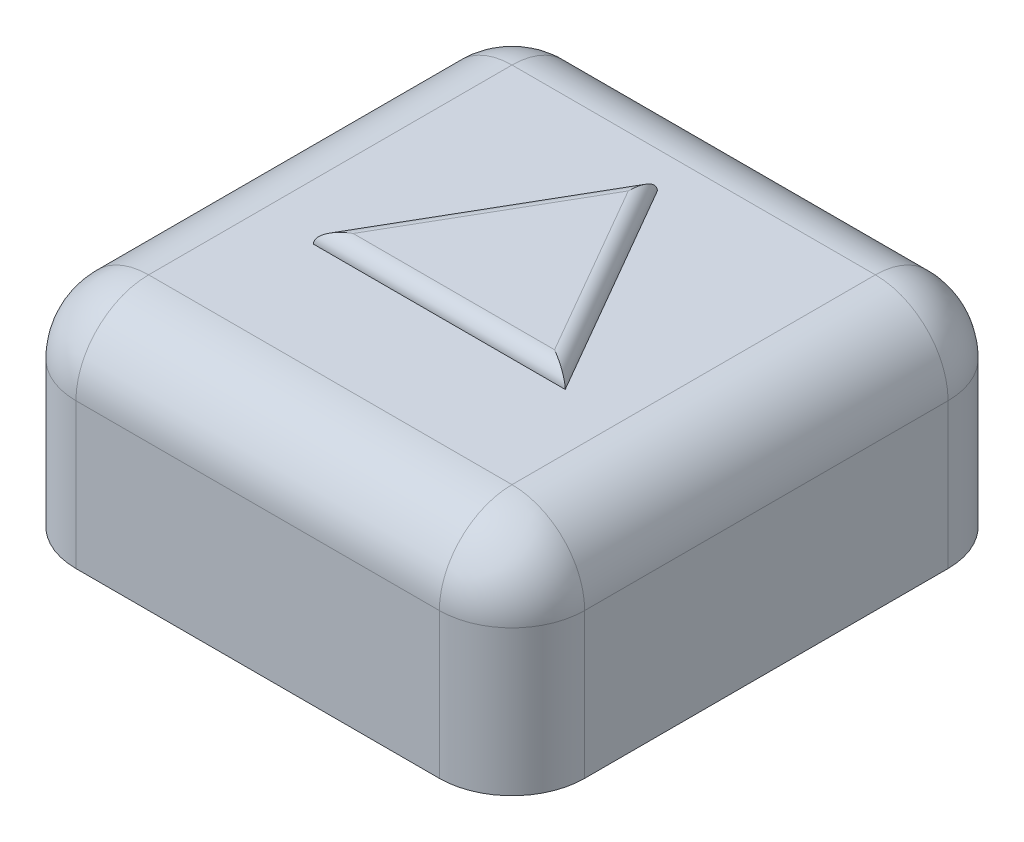
ISO-10303-21;
HEADER;
FILE_DESCRIPTION(('STEP AP214'),'2;1');
FILE_NAME('part.step','',(''),(''),'','','');
FILE_SCHEMA(('AUTOMOTIVE_DESIGN { 1 0 10303 214 1 1 1 1 }'));
ENDSEC;
DATA;
#1=APPLICATION_CONTEXT('core data for automotive mechanical design processes');
#2=APPLICATION_PROTOCOL_DEFINITION('international standard','automotive_design',2000,#1);
#3=PRODUCT_CONTEXT('',#1,'mechanical');
#4=PRODUCT('Part','Part','',(#3));
#5=PRODUCT_RELATED_PRODUCT_CATEGORY('part','',(#4));
#6=PRODUCT_DEFINITION_FORMATION('','',#4);
#7=PRODUCT_DEFINITION_CONTEXT('part definition',#1,'design');
#8=PRODUCT_DEFINITION('design','',#6,#7);
#9=PRODUCT_DEFINITION_SHAPE('','',#8);
#10=(LENGTH_UNIT() NAMED_UNIT(*) SI_UNIT(.MILLI.,.METRE.));
#11=(NAMED_UNIT(*) PLANE_ANGLE_UNIT() SI_UNIT($,.RADIAN.));
#12=(NAMED_UNIT(*) SI_UNIT($,.STERADIAN.) SOLID_ANGLE_UNIT());
#13=UNCERTAINTY_MEASURE_WITH_UNIT(LENGTH_MEASURE(1.E-05),#10,'distance_accuracy_value','');
#14=(GEOMETRIC_REPRESENTATION_CONTEXT(3) GLOBAL_UNCERTAINTY_ASSIGNED_CONTEXT((#13)) GLOBAL_UNIT_ASSIGNED_CONTEXT((#10,
#11,#12)) REPRESENTATION_CONTEXT('',''));
#15=CARTESIAN_POINT('',(0.,0.,0.));
#16=DIRECTION('',(0.,0.,1.));
#17=DIRECTION('',(1.,0.,0.));
#18=AXIS2_PLACEMENT_3D('',#15,#16,#17);
#19=CARTESIAN_POINT('',(0.,3.,0.));
#20=DIRECTION('',(0.,1.,0.));
#21=DIRECTION('',(0.,0.,1.));
#22=AXIS2_PLACEMENT_3D('',#19,#20,#21);
#23=PLANE('',#22);
#24=DIRECTION('',(0.,0.,-1.));
#25=VECTOR('',#24,1.);
#26=CARTESIAN_POINT('',(2.5,3.,-3.5));
#27=LINE('',#26,#25);
#28=CARTESIAN_POINT('',(2.5,3.,2.5));
#29=VERTEX_POINT('',#28);
#30=CARTESIAN_POINT('',(2.5,3.,-2.5));
#31=VERTEX_POINT('',#30);
#32=EDGE_CURVE('E194',#29,#31,#27,.T.);
#33=ORIENTED_EDGE('',*,*,#32,.T.);
#34=DIRECTION('',(-1.,0.,0.));
#35=VECTOR('',#34,1.);
#36=CARTESIAN_POINT('',(-3.5,3.,-2.5));
#37=LINE('',#36,#35);
#38=CARTESIAN_POINT('',(-2.5,3.,-2.5));
#39=VERTEX_POINT('',#38);
#40=EDGE_CURVE('E200',#31,#39,#37,.T.);
#41=ORIENTED_EDGE('',*,*,#40,.T.);
#42=DIRECTION('',(0.,0.,1.));
#43=VECTOR('',#42,1.);
#44=CARTESIAN_POINT('',(-2.5,3.,3.5));
#45=LINE('',#44,#43);
#46=CARTESIAN_POINT('',(-2.5,3.,2.5));
#47=VERTEX_POINT('',#46);
#48=EDGE_CURVE('E198',#39,#47,#45,.T.);
#49=ORIENTED_EDGE('',*,*,#48,.T.);
#50=DIRECTION('',(1.,0.,0.));
#51=VECTOR('',#50,1.);
#52=CARTESIAN_POINT('',(3.5,3.,2.5));
#53=LINE('',#52,#51);
#54=EDGE_CURVE('E196',#47,#29,#53,.T.);
#55=ORIENTED_EDGE('',*,*,#54,.T.);
#56=EDGE_LOOP('',(#33,#41,#49,#55));
#57=FACE_BOUND('',#56,.T.);
#58=DIRECTION('',(-0.500000000000002,0.,0.866025403784437));
#59=VECTOR('',#58,1.);
#60=CARTESIAN_POINT('',(0.,3.,-1.99999999999999));
#61=LINE('',#60,#59);
#62=CARTESIAN_POINT('',(0.,3.,-1.99999999999999));
#63=VERTEX_POINT('',#62);
#64=CARTESIAN_POINT('',(-1.73205080756888,3.,1.));
#65=VERTEX_POINT('',#64);
#66=EDGE_CURVE('E133',#63,#65,#61,.T.);
#67=ORIENTED_EDGE('',*,*,#66,.F.);
#68=DIRECTION('',(-0.500000000000002,0.,-0.866025403784437));
#69=VECTOR('',#68,1.);
#70=CARTESIAN_POINT('',(1.73205080756888,3.,1.));
#71=LINE('',#70,#69);
#72=CARTESIAN_POINT('',(1.73205080756888,3.,1.));
#73=VERTEX_POINT('',#72);
#74=EDGE_CURVE('E138',#73,#63,#71,.T.);
#75=ORIENTED_EDGE('',*,*,#74,.F.);
#76=DIRECTION('',(1.,0.,0.));
#77=VECTOR('',#76,1.);
#78=CARTESIAN_POINT('',(-1.73205080756888,3.,1.));
#79=LINE('',#78,#77);
#80=EDGE_CURVE('E143',#65,#73,#79,.T.);
#81=ORIENTED_EDGE('',*,*,#80,.F.);
#82=EDGE_LOOP('',(#67,#75,#81));
#83=FACE_BOUND('',#82,.T.);
#84=ADVANCED_FACE('F35',(#57,#83),#23,.T.);
#85=CARTESIAN_POINT('',(3.5,3.,-3.5));
#86=DIRECTION('',(-1.,0.,0.));
#87=DIRECTION('',(0.,0.,1.));
#88=AXIS2_PLACEMENT_3D('',#85,#86,#87);
#89=PLANE('',#88);
#90=DIRECTION('',(0.,0.,-1.));
#91=VECTOR('',#90,1.);
#92=CARTESIAN_POINT('',(3.5,0.,-3.5));
#93=LINE('',#92,#91);
#94=CARTESIAN_POINT('',(3.5,0.,2.5));
#95=VERTEX_POINT('',#94);
#96=CARTESIAN_POINT('',(3.5,0.,-2.5));
#97=VERTEX_POINT('',#96);
#98=EDGE_CURVE('E148',#95,#97,#93,.T.);
#99=ORIENTED_EDGE('',*,*,#98,.T.);
#100=DIRECTION('',(0.,-1.,0.));
#101=VECTOR('',#100,1.);
#102=CARTESIAN_POINT('',(3.5,3.,-2.5));
#103=LINE('',#102,#101);
#104=CARTESIAN_POINT('',(3.5,2.,-2.5));
#105=VERTEX_POINT('',#104);
#106=EDGE_CURVE('E180',#97,#105,#103,.F.);
#107=ORIENTED_EDGE('',*,*,#106,.T.);
#108=DIRECTION('',(0.,0.,-1.));
#109=VECTOR('',#108,1.);
#110=CARTESIAN_POINT('',(3.5,2.,3.5));
#111=LINE('',#110,#109);
#112=CARTESIAN_POINT('',(3.5,2.,2.5));
#113=VERTEX_POINT('',#112);
#114=EDGE_CURVE('E176',#105,#113,#111,.F.);
#115=ORIENTED_EDGE('',*,*,#114,.T.);
#116=DIRECTION('',(0.,-1.,0.));
#117=VECTOR('',#116,1.);
#118=CARTESIAN_POINT('',(3.5,3.,2.5));
#119=LINE('',#118,#117);
#120=EDGE_CURVE('E178',#113,#95,#119,.T.);
#121=ORIENTED_EDGE('',*,*,#120,.T.);
#122=EDGE_LOOP('',(#99,#107,#115,#121));
#123=FACE_BOUND('',#122,.T.);
#124=ADVANCED_FACE('F253',(#123),#89,.F.);
#125=CARTESIAN_POINT('',(-3.5,3.,-3.5));
#126=DIRECTION('',(0.,0.,1.));
#127=DIRECTION('',(1.,0.,0.));
#128=AXIS2_PLACEMENT_3D('',#125,#126,#127);
#129=PLANE('',#128);
#130=DIRECTION('',(-1.,0.,0.));
#131=VECTOR('',#130,1.);
#132=CARTESIAN_POINT('',(3.5,2.,-3.5));
#133=LINE('',#132,#131);
#134=CARTESIAN_POINT('',(-2.5,2.,-3.5));
#135=VERTEX_POINT('',#134);
#136=CARTESIAN_POINT('',(2.5,2.,-3.5));
#137=VERTEX_POINT('',#136);
#138=EDGE_CURVE('E161',#135,#137,#133,.F.);
#139=ORIENTED_EDGE('',*,*,#138,.T.);
#140=DIRECTION('',(0.,-1.,0.));
#141=VECTOR('',#140,1.);
#142=CARTESIAN_POINT('',(2.5,3.,-3.5));
#143=LINE('',#142,#141);
#144=CARTESIAN_POINT('',(2.5,0.,-3.5));
#145=VERTEX_POINT('',#144);
#146=EDGE_CURVE('E165',#137,#145,#143,.T.);
#147=ORIENTED_EDGE('',*,*,#146,.T.);
#148=DIRECTION('',(-1.,0.,0.));
#149=VECTOR('',#148,1.);
#150=CARTESIAN_POINT('',(-3.5,0.,-3.5));
#151=LINE('',#150,#149);
#152=CARTESIAN_POINT('',(-2.5,0.,-3.5));
#153=VERTEX_POINT('',#152);
#154=EDGE_CURVE('E151',#145,#153,#151,.T.);
#155=ORIENTED_EDGE('',*,*,#154,.T.);
#156=DIRECTION('',(0.,-1.,0.));
#157=VECTOR('',#156,1.);
#158=CARTESIAN_POINT('',(-2.5,3.,-3.5));
#159=LINE('',#158,#157);
#160=EDGE_CURVE('E163',#153,#135,#159,.F.);
#161=ORIENTED_EDGE('',*,*,#160,.T.);
#162=EDGE_LOOP('',(#139,#147,#155,#161));
#163=FACE_BOUND('',#162,.T.);
#164=ADVANCED_FACE('F258',(#163),#129,.F.);
#165=CARTESIAN_POINT('',(-3.5,3.,-3.5));
#166=DIRECTION('',(1.,0.,0.));
#167=DIRECTION('',(0.,0.,-1.));
#168=AXIS2_PLACEMENT_3D('',#165,#166,#167);
#169=PLANE('',#168);
#170=DIRECTION('',(0.,0.,1.));
#171=VECTOR('',#170,1.);
#172=CARTESIAN_POINT('',(-3.5,2.,-3.5));
#173=LINE('',#172,#171);
#174=CARTESIAN_POINT('',(-3.5,2.,2.5));
#175=VERTEX_POINT('',#174);
#176=CARTESIAN_POINT('',(-3.5,2.,-2.5));
#177=VERTEX_POINT('',#176);
#178=EDGE_CURVE('E182',#175,#177,#173,.F.);
#179=ORIENTED_EDGE('',*,*,#178,.T.);
#180=DIRECTION('',(0.,-1.,0.));
#181=VECTOR('',#180,1.);
#182=CARTESIAN_POINT('',(-3.5,3.,-2.5));
#183=LINE('',#182,#181);
#184=CARTESIAN_POINT('',(-3.5,0.,-2.5));
#185=VERTEX_POINT('',#184);
#186=EDGE_CURVE('E186',#177,#185,#183,.T.);
#187=ORIENTED_EDGE('',*,*,#186,.T.);
#188=DIRECTION('',(0.,0.,1.));
#189=VECTOR('',#188,1.);
#190=CARTESIAN_POINT('',(-3.5,0.,-3.5));
#191=LINE('',#190,#189);
#192=CARTESIAN_POINT('',(-3.5,0.,2.5));
#193=VERTEX_POINT('',#192);
#194=EDGE_CURVE('E155',#185,#193,#191,.T.);
#195=ORIENTED_EDGE('',*,*,#194,.T.);
#196=DIRECTION('',(0.,-1.,0.));
#197=VECTOR('',#196,1.);
#198=CARTESIAN_POINT('',(-3.5,3.,2.5));
#199=LINE('',#198,#197);
#200=EDGE_CURVE('E184',#193,#175,#199,.F.);
#201=ORIENTED_EDGE('',*,*,#200,.T.);
#202=EDGE_LOOP('',(#179,#187,#195,#201));
#203=FACE_BOUND('',#202,.T.);
#204=ADVANCED_FACE('F270',(#203),#169,.F.);
#205=CARTESIAN_POINT('',(-3.5,3.,3.5));
#206=DIRECTION('',(0.,0.,-1.));
#207=DIRECTION('',(-1.,0.,0.));
#208=AXIS2_PLACEMENT_3D('',#205,#206,#207);
#209=PLANE('',#208);
#210=DIRECTION('',(1.,0.,0.));
#211=VECTOR('',#210,1.);
#212=CARTESIAN_POINT('',(-3.5,2.,3.5));
#213=LINE('',#212,#211);
#214=CARTESIAN_POINT('',(2.5,2.,3.5));
#215=VERTEX_POINT('',#214);
#216=CARTESIAN_POINT('',(-2.5,2.,3.5));
#217=VERTEX_POINT('',#216);
#218=EDGE_CURVE('E188',#215,#217,#213,.F.);
#219=ORIENTED_EDGE('',*,*,#218,.T.);
#220=DIRECTION('',(0.,-1.,0.));
#221=VECTOR('',#220,1.);
#222=CARTESIAN_POINT('',(-2.5,3.,3.5));
#223=LINE('',#222,#221);
#224=CARTESIAN_POINT('',(-2.5,0.,3.5));
#225=VERTEX_POINT('',#224);
#226=EDGE_CURVE('E192',#217,#225,#223,.T.);
#227=ORIENTED_EDGE('',*,*,#226,.T.);
#228=DIRECTION('',(1.,0.,0.));
#229=VECTOR('',#228,1.);
#230=CARTESIAN_POINT('',(-3.5,0.,3.5));
#231=LINE('',#230,#229);
#232=CARTESIAN_POINT('',(2.5,0.,3.5));
#233=VERTEX_POINT('',#232);
#234=EDGE_CURVE('E158',#225,#233,#231,.T.);
#235=ORIENTED_EDGE('',*,*,#234,.T.);
#236=DIRECTION('',(0.,-1.,0.));
#237=VECTOR('',#236,1.);
#238=CARTESIAN_POINT('',(2.5,3.,3.5));
#239=LINE('',#238,#237);
#240=EDGE_CURVE('E190',#233,#215,#239,.F.);
#241=ORIENTED_EDGE('',*,*,#240,.T.);
#242=EDGE_LOOP('',(#219,#227,#235,#241));
#243=FACE_BOUND('',#242,.T.);
#244=ADVANCED_FACE('F266',(#243),#209,.F.);
#245=CARTESIAN_POINT('',(0.,0.,0.));
#246=DIRECTION('',(0.,1.,0.));
#247=DIRECTION('',(0.,0.,1.));
#248=AXIS2_PLACEMENT_3D('',#245,#246,#247);
#249=PLANE('',#248);
#250=ORIENTED_EDGE('',*,*,#154,.F.);
#251=CARTESIAN_POINT('',(2.5,0.,-2.5));
#252=DIRECTION('',(0.,1.,0.));
#253=DIRECTION('',(0.,0.,1.));
#254=AXIS2_PLACEMENT_3D('',#251,#252,#253);
#255=CIRCLE('',#254,1.);
#256=EDGE_CURVE('E174',#145,#97,#255,.F.);
#257=ORIENTED_EDGE('',*,*,#256,.T.);
#258=ORIENTED_EDGE('',*,*,#98,.F.);
#259=CARTESIAN_POINT('',(2.5,0.,2.5));
#260=DIRECTION('',(0.,1.,0.));
#261=DIRECTION('',(0.,0.,1.));
#262=AXIS2_PLACEMENT_3D('',#259,#260,#261);
#263=CIRCLE('',#262,1.);
#264=EDGE_CURVE('E168',#95,#233,#263,.F.);
#265=ORIENTED_EDGE('',*,*,#264,.T.);
#266=ORIENTED_EDGE('',*,*,#234,.F.);
#267=CARTESIAN_POINT('',(-2.5,0.,2.5));
#268=DIRECTION('',(0.,1.,0.));
#269=DIRECTION('',(0.,0.,1.));
#270=AXIS2_PLACEMENT_3D('',#267,#268,#269);
#271=CIRCLE('',#270,1.);
#272=EDGE_CURVE('E170',#225,#193,#271,.F.);
#273=ORIENTED_EDGE('',*,*,#272,.T.);
#274=ORIENTED_EDGE('',*,*,#194,.F.);
#275=CARTESIAN_POINT('',(-2.5,0.,-2.5));
#276=DIRECTION('',(0.,1.,0.));
#277=DIRECTION('',(0.,0.,1.));
#278=AXIS2_PLACEMENT_3D('',#275,#276,#277);
#279=CIRCLE('',#278,1.);
#280=EDGE_CURVE('E172',#185,#153,#279,.F.);
#281=ORIENTED_EDGE('',*,*,#280,.T.);
#282=EDGE_LOOP('',(#250,#257,#258,#265,#266,#273,#274,#281));
#283=FACE_BOUND('',#282,.T.);
#284=ADVANCED_FACE('F262',(#283),#249,.F.);
#285=CARTESIAN_POINT('',(-2.5,3.,2.5));
#286=DIRECTION('',(0.,-1.,0.));
#287=DIRECTION('',(0.,0.,-1.));
#288=AXIS2_PLACEMENT_3D('',#285,#286,#287);
#289=CYLINDRICAL_SURFACE('',#288,1.);
#290=CARTESIAN_POINT('',(-2.5,2.,2.5));
#291=DIRECTION('',(0.,1.,0.));
#292=DIRECTION('',(0.,0.,1.));
#293=AXIS2_PLACEMENT_3D('',#290,#291,#292);
#294=CIRCLE('',#293,1.);
#295=EDGE_CURVE('E152',#175,#217,#294,.T.);
#296=ORIENTED_EDGE('',*,*,#295,.F.);
#297=ORIENTED_EDGE('',*,*,#200,.F.);
#298=ORIENTED_EDGE('',*,*,#272,.F.);
#299=ORIENTED_EDGE('',*,*,#226,.F.);
#300=EDGE_LOOP('',(#296,#297,#298,#299));
#301=FACE_BOUND('',#300,.T.);
#302=ADVANCED_FACE('F265',(#301),#289,.T.);
#303=CARTESIAN_POINT('',(-2.5,2.,2.5));
#304=DIRECTION('',(0.,0.,1.));
#305=DIRECTION('',(1.,0.,0.));
#306=AXIS2_PLACEMENT_3D('',#303,#304,#305);
#307=SPHERICAL_SURFACE('',#306,1.);
#308=CARTESIAN_POINT('',(-2.5,2.,2.5));
#309=DIRECTION('',(0.,0.,1.));
#310=DIRECTION('',(1.,0.,0.));
#311=AXIS2_PLACEMENT_3D('',#308,#309,#310);
#312=CIRCLE('',#311,1.);
#313=EDGE_CURVE('E228',#175,#47,#312,.F.);
#314=ORIENTED_EDGE('',*,*,#313,.F.);
#315=ORIENTED_EDGE('',*,*,#295,.T.);
#316=CARTESIAN_POINT('',(-2.5,2.,2.5));
#317=DIRECTION('',(-1.,0.,0.));
#318=DIRECTION('',(0.,0.,1.));
#319=AXIS2_PLACEMENT_3D('',#316,#317,#318);
#320=CIRCLE('',#319,1.);
#321=EDGE_CURVE('E231',#47,#217,#320,.F.);
#322=ORIENTED_EDGE('',*,*,#321,.F.);
#323=EDGE_LOOP('',(#314,#315,#322));
#324=FACE_BOUND('',#323,.T.);
#325=ADVANCED_FACE('F312',(#324),#307,.T.);
#326=CARTESIAN_POINT('',(2.5,3.,2.5));
#327=DIRECTION('',(0.,-1.,0.));
#328=DIRECTION('',(0.,0.,-1.));
#329=AXIS2_PLACEMENT_3D('',#326,#327,#328);
#330=CYLINDRICAL_SURFACE('',#329,1.);
#331=ORIENTED_EDGE('',*,*,#264,.F.);
#332=ORIENTED_EDGE('',*,*,#120,.F.);
#333=CARTESIAN_POINT('',(2.5,2.,2.5));
#334=DIRECTION('',(0.,1.,0.));
#335=DIRECTION('',(0.,0.,1.));
#336=AXIS2_PLACEMENT_3D('',#333,#334,#335);
#337=CIRCLE('',#336,1.);
#338=EDGE_CURVE('E225',#215,#113,#337,.T.);
#339=ORIENTED_EDGE('',*,*,#338,.F.);
#340=ORIENTED_EDGE('',*,*,#240,.F.);
#341=EDGE_LOOP('',(#331,#332,#339,#340));
#342=FACE_BOUND('',#341,.T.);
#343=ADVANCED_FACE('F308',(#342),#330,.T.);
#344=CARTESIAN_POINT('',(0.,2.,2.5));
#345=DIRECTION('',(-1.,0.,0.));
#346=DIRECTION('',(0.,0.,1.));
#347=AXIS2_PLACEMENT_3D('',#344,#345,#346);
#348=CYLINDRICAL_SURFACE('',#347,1.);
#349=ORIENTED_EDGE('',*,*,#321,.T.);
#350=ORIENTED_EDGE('',*,*,#218,.F.);
#351=CARTESIAN_POINT('',(2.5,2.,2.5));
#352=DIRECTION('',(1.,0.,0.));
#353=DIRECTION('',(0.,0.,-1.));
#354=AXIS2_PLACEMENT_3D('',#351,#352,#353);
#355=CIRCLE('',#354,1.);
#356=EDGE_CURVE('E222',#29,#215,#355,.T.);
#357=ORIENTED_EDGE('',*,*,#356,.F.);
#358=ORIENTED_EDGE('',*,*,#54,.F.);
#359=EDGE_LOOP('',(#349,#350,#357,#358));
#360=FACE_BOUND('',#359,.T.);
#361=ADVANCED_FACE('F304',(#360),#348,.T.);
#362=CARTESIAN_POINT('',(-2.5,2.,0.));
#363=DIRECTION('',(0.,0.,-1.));
#364=DIRECTION('',(-1.,0.,0.));
#365=AXIS2_PLACEMENT_3D('',#362,#363,#364);
#366=CYLINDRICAL_SURFACE('',#365,1.);
#367=ORIENTED_EDGE('',*,*,#313,.T.);
#368=ORIENTED_EDGE('',*,*,#48,.F.);
#369=CARTESIAN_POINT('',(-2.5,2.,-2.5));
#370=DIRECTION('',(0.,0.,-1.));
#371=DIRECTION('',(-1.,0.,0.));
#372=AXIS2_PLACEMENT_3D('',#369,#370,#371);
#373=CIRCLE('',#372,1.);
#374=EDGE_CURVE('E219',#177,#39,#373,.T.);
#375=ORIENTED_EDGE('',*,*,#374,.F.);
#376=ORIENTED_EDGE('',*,*,#178,.F.);
#377=EDGE_LOOP('',(#367,#368,#375,#376));
#378=FACE_BOUND('',#377,.T.);
#379=ADVANCED_FACE('F300',(#378),#366,.T.);
#380=CARTESIAN_POINT('',(-2.5,3.,-2.5));
#381=DIRECTION('',(0.,-1.,0.));
#382=DIRECTION('',(0.,0.,-1.));
#383=AXIS2_PLACEMENT_3D('',#380,#381,#382);
#384=CYLINDRICAL_SURFACE('',#383,1.);
#385=ORIENTED_EDGE('',*,*,#280,.F.);
#386=ORIENTED_EDGE('',*,*,#186,.F.);
#387=CARTESIAN_POINT('',(-2.5,2.,-2.5));
#388=DIRECTION('',(0.,1.,0.));
#389=DIRECTION('',(0.,0.,1.));
#390=AXIS2_PLACEMENT_3D('',#387,#388,#389);
#391=CIRCLE('',#390,1.);
#392=EDGE_CURVE('E216',#135,#177,#391,.T.);
#393=ORIENTED_EDGE('',*,*,#392,.F.);
#394=ORIENTED_EDGE('',*,*,#160,.F.);
#395=EDGE_LOOP('',(#385,#386,#393,#394));
#396=FACE_BOUND('',#395,.T.);
#397=ADVANCED_FACE('F296',(#396),#384,.T.);
#398=CARTESIAN_POINT('',(2.5,2.,2.5));
#399=DIRECTION('',(0.,0.,1.));
#400=DIRECTION('',(1.,0.,0.));
#401=AXIS2_PLACEMENT_3D('',#398,#399,#400);
#402=SPHERICAL_SURFACE('',#401,1.);
#403=ORIENTED_EDGE('',*,*,#356,.T.);
#404=ORIENTED_EDGE('',*,*,#338,.T.);
#405=CARTESIAN_POINT('',(2.5,2.,2.5));
#406=DIRECTION('',(0.,0.,1.));
#407=DIRECTION('',(0.,-1.,0.));
#408=AXIS2_PLACEMENT_3D('',#405,#406,#407);
#409=CIRCLE('',#408,1.);
#410=EDGE_CURVE('E213',#29,#113,#409,.F.);
#411=ORIENTED_EDGE('',*,*,#410,.F.);
#412=EDGE_LOOP('',(#403,#404,#411));
#413=FACE_BOUND('',#412,.T.);
#414=ADVANCED_FACE('F292',(#413),#402,.T.);
#415=CARTESIAN_POINT('',(-2.5,2.,-2.5));
#416=DIRECTION('',(0.,0.,1.));
#417=DIRECTION('',(1.,0.,0.));
#418=AXIS2_PLACEMENT_3D('',#415,#416,#417);
#419=SPHERICAL_SURFACE('',#418,1.);
#420=ORIENTED_EDGE('',*,*,#392,.T.);
#421=ORIENTED_EDGE('',*,*,#374,.T.);
#422=CARTESIAN_POINT('',(-2.5,2.,-2.5));
#423=DIRECTION('',(-1.,0.,0.));
#424=DIRECTION('',(0.,0.,1.));
#425=AXIS2_PLACEMENT_3D('',#422,#423,#424);
#426=CIRCLE('',#425,1.);
#427=EDGE_CURVE('E211',#135,#39,#426,.F.);
#428=ORIENTED_EDGE('',*,*,#427,.F.);
#429=EDGE_LOOP('',(#420,#421,#428));
#430=FACE_BOUND('',#429,.T.);
#431=ADVANCED_FACE('F288',(#430),#419,.T.);
#432=CARTESIAN_POINT('',(2.5,2.,0.));
#433=DIRECTION('',(0.,0.,1.));
#434=DIRECTION('',(1.,0.,0.));
#435=AXIS2_PLACEMENT_3D('',#432,#433,#434);
#436=CYLINDRICAL_SURFACE('',#435,1.);
#437=ORIENTED_EDGE('',*,*,#410,.T.);
#438=ORIENTED_EDGE('',*,*,#114,.F.);
#439=CARTESIAN_POINT('',(2.5,2.,-2.5));
#440=DIRECTION('',(0.,0.,-1.));
#441=DIRECTION('',(-1.,0.,0.));
#442=AXIS2_PLACEMENT_3D('',#439,#440,#441);
#443=CIRCLE('',#442,1.);
#444=EDGE_CURVE('E208',#31,#105,#443,.T.);
#445=ORIENTED_EDGE('',*,*,#444,.F.);
#446=ORIENTED_EDGE('',*,*,#32,.F.);
#447=EDGE_LOOP('',(#437,#438,#445,#446));
#448=FACE_BOUND('',#447,.T.);
#449=ADVANCED_FACE('F284',(#448),#436,.T.);
#450=CARTESIAN_POINT('',(0.,2.,-2.5));
#451=DIRECTION('',(1.,0.,0.));
#452=DIRECTION('',(0.,0.,-1.));
#453=AXIS2_PLACEMENT_3D('',#450,#451,#452);
#454=CYLINDRICAL_SURFACE('',#453,1.);
#455=ORIENTED_EDGE('',*,*,#427,.T.);
#456=ORIENTED_EDGE('',*,*,#40,.F.);
#457=CARTESIAN_POINT('',(2.5,2.,-2.5));
#458=DIRECTION('',(1.,0.,0.));
#459=DIRECTION('',(0.,0.,-1.));
#460=AXIS2_PLACEMENT_3D('',#457,#458,#459);
#461=CIRCLE('',#460,1.);
#462=EDGE_CURVE('E205',#137,#31,#461,.T.);
#463=ORIENTED_EDGE('',*,*,#462,.F.);
#464=ORIENTED_EDGE('',*,*,#138,.F.);
#465=EDGE_LOOP('',(#455,#456,#463,#464));
#466=FACE_BOUND('',#465,.T.);
#467=ADVANCED_FACE('F280',(#466),#454,.T.);
#468=CARTESIAN_POINT('',(2.5,2.,-2.5));
#469=DIRECTION('',(0.,0.,1.));
#470=DIRECTION('',(1.,0.,0.));
#471=AXIS2_PLACEMENT_3D('',#468,#469,#470);
#472=SPHERICAL_SURFACE('',#471,1.);
#473=ORIENTED_EDGE('',*,*,#462,.T.);
#474=ORIENTED_EDGE('',*,*,#444,.T.);
#475=CARTESIAN_POINT('',(2.5,2.,-2.5));
#476=DIRECTION('',(0.,1.,0.));
#477=DIRECTION('',(0.,0.,1.));
#478=AXIS2_PLACEMENT_3D('',#475,#476,#477);
#479=CIRCLE('',#478,1.);
#480=EDGE_CURVE('E145',#137,#105,#479,.F.);
#481=ORIENTED_EDGE('',*,*,#480,.F.);
#482=EDGE_LOOP('',(#473,#474,#481));
#483=FACE_BOUND('',#482,.T.);
#484=ADVANCED_FACE('F248',(#483),#472,.T.);
#485=CARTESIAN_POINT('',(2.5,3.,-2.5));
#486=DIRECTION('',(0.,-1.,0.));
#487=DIRECTION('',(0.,0.,-1.));
#488=AXIS2_PLACEMENT_3D('',#485,#486,#487);
#489=CYLINDRICAL_SURFACE('',#488,1.);
#490=ORIENTED_EDGE('',*,*,#480,.T.);
#491=ORIENTED_EDGE('',*,*,#106,.F.);
#492=ORIENTED_EDGE('',*,*,#256,.F.);
#493=ORIENTED_EDGE('',*,*,#146,.F.);
#494=EDGE_LOOP('',(#490,#491,#492,#493));
#495=FACE_BOUND('',#494,.T.);
#496=ADVANCED_FACE('F242',(#495),#489,.T.);
#497=CARTESIAN_POINT('',(0.,3.2,0.));
#498=DIRECTION('',(0.,1.,0.));
#499=DIRECTION('',(0.,0.,1.));
#500=AXIS2_PLACEMENT_3D('',#497,#498,#499);
#501=PLANE('',#500);
#502=DIRECTION('',(-0.500000000000002,0.,-0.866025403784437));
#503=VECTOR('',#502,1.);
#504=CARTESIAN_POINT('',(-0.173205080756888,3.2,-1.89999999999999));
#505=LINE('',#504,#503);
#506=CARTESIAN_POINT('',(1.38564064605511,3.2,0.8));
#507=VERTEX_POINT('',#506);
#508=CARTESIAN_POINT('',(0.,3.2,-1.59999999999999));
#509=VERTEX_POINT('',#508);
#510=EDGE_CURVE('E44',#507,#509,#505,.T.);
#511=ORIENTED_EDGE('',*,*,#510,.T.);
#512=DIRECTION('',(-0.500000000000002,0.,0.866025403784438));
#513=VECTOR('',#512,1.);
#514=CARTESIAN_POINT('',(-1.55884572681199,3.2,1.1));
#515=LINE('',#514,#513);
#516=CARTESIAN_POINT('',(-1.38564064605511,3.2,0.8));
#517=VERTEX_POINT('',#516);
#518=EDGE_CURVE('E11',#509,#517,#515,.T.);
#519=ORIENTED_EDGE('',*,*,#518,.T.);
#520=DIRECTION('',(1.,0.,0.));
#521=VECTOR('',#520,1.);
#522=CARTESIAN_POINT('',(1.73205080756888,3.2,0.8));
#523=LINE('',#522,#521);
#524=EDGE_CURVE('E54',#517,#507,#523,.T.);
#525=ORIENTED_EDGE('',*,*,#524,.T.);
#526=EDGE_LOOP('',(#511,#519,#525));
#527=FACE_BOUND('',#526,.T.);
#528=ADVANCED_FACE('F240',(#527),#501,.T.);
#529=CARTESIAN_POINT('',(0.69282032302755,3.,-0.400000000000001));
#530=DIRECTION('',(0.500000000000002,0.,0.866025403784437));
#531=DIRECTION('',(0.866025403784438,0.,-0.500000000000002));
#532=AXIS2_PLACEMENT_3D('',#529,#530,#531);
#533=CYLINDRICAL_SURFACE('',#532,0.2);
#534=CARTESIAN_POINT('',(0.,3.,-1.59999999999999));
#535=DIRECTION('',(1.,0.,0.));
#536=DIRECTION('',(0.,0.,1.));
#537=AXIS2_PLACEMENT_3D('',#534,#535,#536);
#538=ELLIPSE('',#537,0.399999999999998,0.2);
#539=EDGE_CURVE('E129',#509,#63,#538,.F.);
#540=ORIENTED_EDGE('',*,*,#539,.F.);
#541=ORIENTED_EDGE('',*,*,#510,.F.);
#542=CARTESIAN_POINT('',(1.38564064605511,3.,0.8));
#543=DIRECTION('',(-0.499999999999999,0.,0.866025403784439));
#544=DIRECTION('',(-0.866025403784439,0.,-0.499999999999999));
#545=AXIS2_PLACEMENT_3D('',#542,#543,#544);
#546=ELLIPSE('',#545,0.400000000000001,0.2);
#547=EDGE_CURVE('E39',#73,#507,#546,.T.);
#548=ORIENTED_EDGE('',*,*,#547,.F.);
#549=ORIENTED_EDGE('',*,*,#74,.T.);
#550=EDGE_LOOP('',(#540,#541,#548,#549));
#551=FACE_BOUND('',#550,.T.);
#552=ADVANCED_FACE('F37',(#551),#533,.T.);
#553=CARTESIAN_POINT('',(0.,3.,0.8));
#554=DIRECTION('',(-1.,0.,0.));
#555=DIRECTION('',(0.,0.,1.));
#556=AXIS2_PLACEMENT_3D('',#553,#554,#555);
#557=CYLINDRICAL_SURFACE('',#556,0.2);
#558=ORIENTED_EDGE('',*,*,#547,.T.);
#559=ORIENTED_EDGE('',*,*,#524,.F.);
#560=CARTESIAN_POINT('',(-1.3856406460551,3.,0.8));
#561=DIRECTION('',(-0.499999999999999,0.,-0.866025403784439));
#562=DIRECTION('',(-0.866025403784439,0.,0.499999999999999));
#563=AXIS2_PLACEMENT_3D('',#560,#561,#562);
#564=ELLIPSE('',#563,0.400000000000001,0.2);
#565=EDGE_CURVE('E136',#65,#517,#564,.T.);
#566=ORIENTED_EDGE('',*,*,#565,.F.);
#567=ORIENTED_EDGE('',*,*,#80,.T.);
#568=EDGE_LOOP('',(#558,#559,#566,#567));
#569=FACE_BOUND('',#568,.T.);
#570=ADVANCED_FACE('F239',(#569),#557,.T.);
#571=CARTESIAN_POINT('',(-0.69282032302755,3.,-0.400000000000001));
#572=DIRECTION('',(0.500000000000002,0.,-0.866025403784438));
#573=DIRECTION('',(-0.866025403784438,0.,-0.500000000000002));
#574=AXIS2_PLACEMENT_3D('',#571,#572,#573);
#575=CYLINDRICAL_SURFACE('',#574,0.2);
#576=ORIENTED_EDGE('',*,*,#539,.T.);
#577=ORIENTED_EDGE('',*,*,#66,.T.);
#578=ORIENTED_EDGE('',*,*,#565,.T.);
#579=ORIENTED_EDGE('',*,*,#518,.F.);
#580=EDGE_LOOP('',(#576,#577,#578,#579));
#581=FACE_BOUND('',#580,.T.);
#582=ADVANCED_FACE('F131',(#581),#575,.T.);
#583=CLOSED_SHELL('',(#84,#124,#164,#204,#244,#284,#302,#325,#343,#361,#379,#397,#414,#431,#449,
#467,#484,#496,#528,#552,#570,#582));
#584=MANIFOLD_SOLID_BREP('B2',#583);
#585=ADVANCED_BREP_SHAPE_REPRESENTATION('',(#18,#584),#14);
#586=SHAPE_DEFINITION_REPRESENTATION(#9,#585);
ENDSEC;
END-ISO-10303-21;
